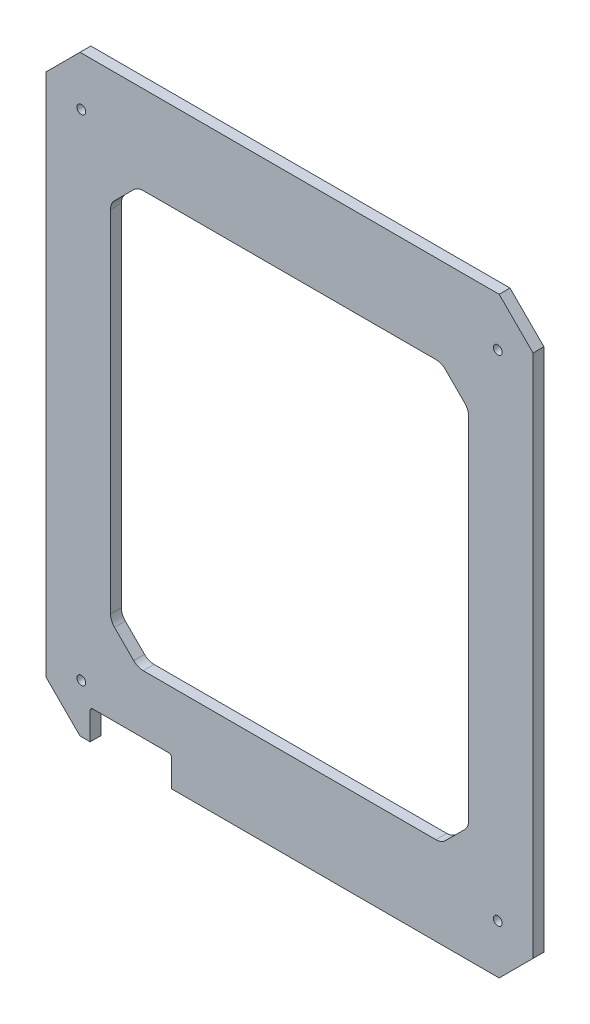
ISO-10303-21;
HEADER;
FILE_DESCRIPTION(('STEP AP214'),'2;1');
FILE_NAME('part.step','',(''),(''),'','','');
FILE_SCHEMA(('AUTOMOTIVE_DESIGN { 1 0 10303 214 1 1 1 1 }'));
ENDSEC;
DATA;
#1=APPLICATION_CONTEXT('core data for automotive mechanical design processes');
#2=APPLICATION_PROTOCOL_DEFINITION('international standard','automotive_design',2000,#1);
#3=PRODUCT_CONTEXT('',#1,'mechanical');
#4=PRODUCT('Part','Part','',(#3));
#5=PRODUCT_RELATED_PRODUCT_CATEGORY('part','',(#4));
#6=PRODUCT_DEFINITION_FORMATION('','',#4);
#7=PRODUCT_DEFINITION_CONTEXT('part definition',#1,'design');
#8=PRODUCT_DEFINITION('design','',#6,#7);
#9=PRODUCT_DEFINITION_SHAPE('','',#8);
#10=(LENGTH_UNIT() NAMED_UNIT(*) SI_UNIT(.MILLI.,.METRE.));
#11=(NAMED_UNIT(*) PLANE_ANGLE_UNIT() SI_UNIT($,.RADIAN.));
#12=(NAMED_UNIT(*) SI_UNIT($,.STERADIAN.) SOLID_ANGLE_UNIT());
#13=UNCERTAINTY_MEASURE_WITH_UNIT(LENGTH_MEASURE(1.E-05),#10,'distance_accuracy_value','');
#14=(GEOMETRIC_REPRESENTATION_CONTEXT(3) GLOBAL_UNCERTAINTY_ASSIGNED_CONTEXT((#13)) GLOBAL_UNIT_ASSIGNED_CONTEXT((#10,
#11,#12)) REPRESENTATION_CONTEXT('',''));
#15=CARTESIAN_POINT('',(0.,0.,0.));
#16=DIRECTION('',(0.,0.,1.));
#17=DIRECTION('',(1.,0.,0.));
#18=AXIS2_PLACEMENT_3D('',#15,#16,#17);
#19=CARTESIAN_POINT('',(-154.499999958625,-218.249999957125,0.));
#20=DIRECTION('',(0.,-1.,0.));
#21=DIRECTION('',(0.,0.,-1.));
#22=AXIS2_PLACEMENT_3D('',#19,#20,#21);
#23=PLANE('',#22);
#24=DIRECTION('',(0.,0.,1.));
#25=VECTOR('',#24,1.);
#26=CARTESIAN_POINT('',(-87.,-218.249999957125,-0.001000000000001));
#27=LINE('',#26,#25);
#28=CARTESIAN_POINT('',(-87.,-218.249999957125,0.));
#29=VERTEX_POINT('',#28);
#30=CARTESIAN_POINT('',(-87.,-218.249999957125,8.));
#31=VERTEX_POINT('',#30);
#32=EDGE_CURVE('E300',#29,#31,#27,.T.);
#33=ORIENTED_EDGE('',*,*,#32,.F.);
#34=DIRECTION('',(1.,0.,0.));
#35=VECTOR('',#34,1.);
#36=CARTESIAN_POINT('',(-154.499999958625,-218.249999957125,0.));
#37=LINE('',#36,#35);
#38=CARTESIAN_POINT('',(154.500000044375,-218.249999957125,0.));
#39=VERTEX_POINT('',#38);
#40=EDGE_CURVE('E456',#29,#39,#37,.T.);
#41=ORIENTED_EDGE('',*,*,#40,.T.);
#42=DIRECTION('',(0.,0.,1.));
#43=VECTOR('',#42,1.);
#44=CARTESIAN_POINT('',(154.500000044375,-218.249999957125,0.));
#45=LINE('',#44,#43);
#46=CARTESIAN_POINT('',(154.500000044375,-218.249999957125,8.));
#47=VERTEX_POINT('',#46);
#48=EDGE_CURVE('E509',#39,#47,#45,.T.);
#49=ORIENTED_EDGE('',*,*,#48,.T.);
#50=DIRECTION('',(1.,0.,0.));
#51=VECTOR('',#50,1.);
#52=CARTESIAN_POINT('',(-154.499999958625,-218.249999957125,8.));
#53=LINE('',#52,#51);
#54=EDGE_CURVE('E480',#31,#47,#53,.T.);
#55=ORIENTED_EDGE('',*,*,#54,.F.);
#56=EDGE_LOOP('',(#33,#41,#49,#55));
#57=FACE_BOUND('',#56,.T.);
#58=ADVANCED_FACE('F41',(#57),#23,.T.);
#59=CARTESIAN_POINT('',(0.,0.,0.));
#60=DIRECTION('',(0.,0.,1.));
#61=DIRECTION('',(1.,0.,0.));
#62=AXIS2_PLACEMENT_3D('',#59,#60,#61);
#63=PLANE('',#62);
#64=CARTESIAN_POINT('',(153.5,-182.25,0.));
#65=DIRECTION('',(0.,0.,-1.));
#66=DIRECTION('',(-1.,0.,0.));
#67=AXIS2_PLACEMENT_3D('',#64,#65,#66);
#68=CIRCLE('',#67,3.25);
#69=CARTESIAN_POINT('',(150.25,-182.25,0.));
#70=VERTEX_POINT('',#69);
#71=EDGE_CURVE('E260',#70,#70,#68,.T.);
#72=ORIENTED_EDGE('',*,*,#71,.F.);
#73=EDGE_LOOP('',(#72));
#74=FACE_BOUND('',#73,.T.);
#75=CARTESIAN_POINT('',(-153.5,-182.25,0.));
#76=DIRECTION('',(0.,0.,-1.));
#77=DIRECTION('',(-1.,0.,0.));
#78=AXIS2_PLACEMENT_3D('',#75,#76,#77);
#79=CIRCLE('',#78,3.25);
#80=CARTESIAN_POINT('',(-156.75,-182.25,0.));
#81=VERTEX_POINT('',#80);
#82=EDGE_CURVE('E308',#81,#81,#79,.T.);
#83=ORIENTED_EDGE('',*,*,#82,.F.);
#84=EDGE_LOOP('',(#83));
#85=FACE_BOUND('',#84,.T.);
#86=CARTESIAN_POINT('',(153.5,182.25,0.));
#87=DIRECTION('',(0.,0.,-1.));
#88=DIRECTION('',(-1.,0.,0.));
#89=AXIS2_PLACEMENT_3D('',#86,#87,#88);
#90=CIRCLE('',#89,3.25);
#91=CARTESIAN_POINT('',(150.25,182.25,0.));
#92=VERTEX_POINT('',#91);
#93=EDGE_CURVE('E314',#92,#92,#90,.T.);
#94=ORIENTED_EDGE('',*,*,#93,.F.);
#95=EDGE_LOOP('',(#94));
#96=FACE_BOUND('',#95,.T.);
#97=DIRECTION('',(-1.,0.,0.));
#98=VECTOR('',#97,1.);
#99=CARTESIAN_POINT('',(107.857864328668,-153.249999986912,0.));
#100=LINE('',#99,#98);
#101=CARTESIAN_POINT('',(107.857864328668,-153.249999986912,0.));
#102=VERTEX_POINT('',#101);
#103=CARTESIAN_POINT('',(-107.857864423332,-153.249999986913,0.));
#104=VERTEX_POINT('',#103);
#105=EDGE_CURVE('E377',#102,#104,#100,.T.);
#106=ORIENTED_EDGE('',*,*,#105,.F.);
#107=CARTESIAN_POINT('',(107.857864328668,-143.24999998392,0.));
#108=DIRECTION('',(0.,0.,-1.));
#109=DIRECTION('',(-1.,0.,0.));
#110=AXIS2_PLACEMENT_3D('',#107,#108,#109);
#111=CIRCLE('',#110,10.0000000029924);
#112=CARTESIAN_POINT('',(114.928932142649,-150.321067797901,0.));
#113=VERTEX_POINT('',#112);
#114=EDGE_CURVE('E66',#113,#102,#111,.T.);
#115=ORIENTED_EDGE('',*,*,#114,.F.);
#116=DIRECTION('',(-0.707106781186549,-0.707106781186546,0.));
#117=VECTOR('',#116,1.);
#118=CARTESIAN_POINT('',(129.07106776665,-136.178932173902,0.));
#119=LINE('',#118,#117);
#120=CARTESIAN_POINT('',(129.07106776665,-136.178932173902,0.));
#121=VERTEX_POINT('',#120);
#122=EDGE_CURVE('E330',#121,#113,#119,.T.);
#123=ORIENTED_EDGE('',*,*,#122,.F.);
#124=CARTESIAN_POINT('',(121.999999968748,-129.107864376,0.));
#125=DIRECTION('',(0.,0.,-1.));
#126=DIRECTION('',(-1.,0.,0.));
#127=AXIS2_PLACEMENT_3D('',#124,#125,#126);
#128=CIRCLE('',#127,9.99999998025203);
#129=CARTESIAN_POINT('',(131.999999949,-129.107864376,0.));
#130=VERTEX_POINT('',#129);
#131=EDGE_CURVE('E416',#130,#121,#128,.T.);
#132=ORIENTED_EDGE('',*,*,#131,.F.);
#133=DIRECTION('',(0.,-1.,0.));
#134=VECTOR('',#133,1.);
#135=CARTESIAN_POINT('',(131.999999949,129.107864376,0.));
#136=LINE('',#135,#134);
#137=CARTESIAN_POINT('',(131.999999949,129.107864376,0.));
#138=VERTEX_POINT('',#137);
#139=EDGE_CURVE('E413',#138,#130,#136,.T.);
#140=ORIENTED_EDGE('',*,*,#139,.F.);
#141=CARTESIAN_POINT('',(121.999999968796,129.107864376,0.));
#142=DIRECTION('',(0.,0.,-1.));
#143=DIRECTION('',(-1.,0.,0.));
#144=AXIS2_PLACEMENT_3D('',#141,#142,#143);
#145=CIRCLE('',#144,9.99999998020447);
#146=CARTESIAN_POINT('',(129.071067766664,136.178932173868,0.));
#147=VERTEX_POINT('',#146);
#148=EDGE_CURVE('E410',#147,#138,#145,.T.);
#149=ORIENTED_EDGE('',*,*,#148,.F.);
#150=DIRECTION('',(0.707106781186548,-0.707106781186547,0.));
#151=VECTOR('',#150,1.);
#152=CARTESIAN_POINT('',(114.928932142663,150.321067797868,0.));
#153=LINE('',#152,#151);
#154=CARTESIAN_POINT('',(114.928932142663,150.321067797868,0.));
#155=VERTEX_POINT('',#154);
#156=EDGE_CURVE('E407',#155,#147,#153,.T.);
#157=ORIENTED_EDGE('',*,*,#156,.F.);
#158=CARTESIAN_POINT('',(107.857864328648,143.249999983853,0.));
#159=DIRECTION('',(0.,0.,-1.));
#160=DIRECTION('',(-1.,0.,0.));
#161=AXIS2_PLACEMENT_3D('',#158,#159,#160);
#162=CIRCLE('',#161,10.0000000030401);
#163=CARTESIAN_POINT('',(107.857864328648,153.249999986893,0.));
#164=VERTEX_POINT('',#163);
#165=EDGE_CURVE('E404',#164,#155,#162,.T.);
#166=ORIENTED_EDGE('',*,*,#165,.F.);
#167=DIRECTION('',(1.,0.,0.));
#168=VECTOR('',#167,1.);
#169=CARTESIAN_POINT('',(-107.857864423352,153.249999986893,0.));
#170=LINE('',#169,#168);
#171=CARTESIAN_POINT('',(-107.857864423352,153.249999986893,0.));
#172=VERTEX_POINT('',#171);
#173=EDGE_CURVE('E401',#172,#164,#170,.T.);
#174=ORIENTED_EDGE('',*,*,#173,.F.);
#175=CARTESIAN_POINT('',(-107.857864423352,143.2499999839,0.));
#176=DIRECTION('',(0.,0.,-1.));
#177=DIRECTION('',(-1.,0.,0.));
#178=AXIS2_PLACEMENT_3D('',#175,#176,#177);
#179=CIRCLE('',#178,10.0000000029925);
#180=CARTESIAN_POINT('',(-114.928932237333,150.321067797882,0.));
#181=VERTEX_POINT('',#180);
#182=EDGE_CURVE('E398',#181,#172,#179,.T.);
#183=ORIENTED_EDGE('',*,*,#182,.F.);
#184=DIRECTION('',(0.707106781186546,0.707106781186549,0.));
#185=VECTOR('',#184,1.);
#186=CARTESIAN_POINT('',(-129.071067861333,136.178932173882,0.));
#187=LINE('',#186,#185);
#188=CARTESIAN_POINT('',(-129.071067861333,136.178932173882,0.));
#189=VERTEX_POINT('',#188);
#190=EDGE_CURVE('E395',#189,#181,#187,.T.);
#191=ORIENTED_EDGE('',*,*,#190,.F.);
#192=CARTESIAN_POINT('',(-122.000000063432,129.10786437598,0.));
#193=DIRECTION('',(0.,0.,-1.));
#194=DIRECTION('',(-1.,0.,0.));
#195=AXIS2_PLACEMENT_3D('',#192,#193,#194);
#196=CIRCLE('',#195,9.99999998025202);
#197=CARTESIAN_POINT('',(-132.000000043684,129.10786437598,0.));
#198=VERTEX_POINT('',#197);
#199=EDGE_CURVE('E392',#198,#189,#196,.T.);
#200=ORIENTED_EDGE('',*,*,#199,.F.);
#201=DIRECTION('',(0.,1.,0.));
#202=VECTOR('',#201,1.);
#203=CARTESIAN_POINT('',(-132.000000043684,-129.10786437602,0.));
#204=LINE('',#203,#202);
#205=CARTESIAN_POINT('',(-132.000000043684,-129.10786437602,0.));
#206=VERTEX_POINT('',#205);
#207=EDGE_CURVE('E389',#206,#198,#204,.T.);
#208=ORIENTED_EDGE('',*,*,#207,.F.);
#209=CARTESIAN_POINT('',(-122.000000063479,-129.10786437602,0.));
#210=DIRECTION('',(0.,0.,-1.));
#211=DIRECTION('',(-1.,0.,0.));
#212=AXIS2_PLACEMENT_3D('',#209,#210,#211);
#213=CIRCLE('',#212,9.99999998020442);
#214=CARTESIAN_POINT('',(-129.071067861347,-136.178932173888,0.));
#215=VERTEX_POINT('',#214);
#216=EDGE_CURVE('E386',#215,#206,#213,.T.);
#217=ORIENTED_EDGE('',*,*,#216,.F.);
#218=DIRECTION('',(-0.707106781186548,0.707106781186547,0.));
#219=VECTOR('',#218,1.);
#220=CARTESIAN_POINT('',(-114.928932237347,-150.321067797888,0.));
#221=LINE('',#220,#219);
#222=CARTESIAN_POINT('',(-114.928932237347,-150.321067797888,0.));
#223=VERTEX_POINT('',#222);
#224=EDGE_CURVE('E383',#223,#215,#221,.T.);
#225=ORIENTED_EDGE('',*,*,#224,.F.);
#226=CARTESIAN_POINT('',(-107.857864423332,-143.249999983872,0.));
#227=DIRECTION('',(0.,0.,-1.));
#228=DIRECTION('',(-1.,0.,0.));
#229=AXIS2_PLACEMENT_3D('',#226,#227,#228);
#230=CIRCLE('',#229,10.00000000304);
#231=EDGE_CURVE('E380',#104,#223,#230,.T.);
#232=ORIENTED_EDGE('',*,*,#231,.F.);
#233=EDGE_LOOP('',(#106,#115,#123,#132,#140,#149,#157,#166,#174,#183,#191,#200,#208,#217,#225,#232));
#234=FACE_BOUND('',#233,.T.);
#235=ORIENTED_EDGE('',*,*,#40,.F.);
#236=DIRECTION('',(0.,-1.,0.));
#237=VECTOR('',#236,1.);
#238=CARTESIAN_POINT('',(-87.,-218.249999957125,0.));
#239=LINE('',#238,#237);
#240=CARTESIAN_POINT('',(-87.,-198.249999957125,0.));
#241=VERTEX_POINT('',#240);
#242=EDGE_CURVE('E277',#241,#29,#239,.T.);
#243=ORIENTED_EDGE('',*,*,#242,.F.);
#244=CARTESIAN_POINT('',(-89.,-198.249999957125,0.));
#245=DIRECTION('',(0.,0.,1.));
#246=DIRECTION('',(1.,0.,0.));
#247=AXIS2_PLACEMENT_3D('',#244,#245,#246);
#248=CIRCLE('',#247,2.);
#249=CARTESIAN_POINT('',(-89.,-196.249999957125,0.));
#250=VERTEX_POINT('',#249);
#251=EDGE_CURVE('E271',#250,#241,#248,.F.);
#252=ORIENTED_EDGE('',*,*,#251,.F.);
#253=DIRECTION('',(1.,0.,0.));
#254=VECTOR('',#253,1.);
#255=CARTESIAN_POINT('',(-89.,-196.249999957125,0.));
#256=LINE('',#255,#254);
#257=CARTESIAN_POINT('',(-145.,-196.249999957125,0.));
#258=VERTEX_POINT('',#257);
#259=EDGE_CURVE('E268',#258,#250,#256,.T.);
#260=ORIENTED_EDGE('',*,*,#259,.F.);
#261=CARTESIAN_POINT('',(-145.,-198.249999957125,0.));
#262=DIRECTION('',(0.,0.,1.));
#263=DIRECTION('',(1.,0.,0.));
#264=AXIS2_PLACEMENT_3D('',#261,#262,#263);
#265=CIRCLE('',#264,1.99999999999999);
#266=CARTESIAN_POINT('',(-147.,-198.249999957125,0.));
#267=VERTEX_POINT('',#266);
#268=EDGE_CURVE('E247',#267,#258,#265,.F.);
#269=ORIENTED_EDGE('',*,*,#268,.F.);
#270=DIRECTION('',(0.,1.,0.));
#271=VECTOR('',#270,1.);
#272=CARTESIAN_POINT('',(-147.,-198.249999957125,0.));
#273=LINE('',#272,#271);
#274=CARTESIAN_POINT('',(-147.,-218.249999957125,0.));
#275=VERTEX_POINT('',#274);
#276=EDGE_CURVE('E255',#275,#267,#273,.T.);
#277=ORIENTED_EDGE('',*,*,#276,.F.);
#278=CARTESIAN_POINT('',(-154.499999958625,-218.249999957125,0.));
#279=VERTEX_POINT('',#278);
#280=EDGE_CURVE('E458',#279,#275,#37,.T.);
#281=ORIENTED_EDGE('',*,*,#280,.F.);
#282=DIRECTION('',(0.707106781186548,-0.707106781186548,0.));
#283=VECTOR('',#282,1.);
#284=CARTESIAN_POINT('',(-179.5,-193.24999991575,0.));
#285=LINE('',#284,#283);
#286=CARTESIAN_POINT('',(-179.5,-193.24999991575,0.));
#287=VERTEX_POINT('',#286);
#288=EDGE_CURVE('E453',#287,#279,#285,.T.);
#289=ORIENTED_EDGE('',*,*,#288,.F.);
#290=DIRECTION('',(0.,-1.,0.));
#291=VECTOR('',#290,1.);
#292=CARTESIAN_POINT('',(-179.5,193.24999991575,0.));
#293=LINE('',#292,#291);
#294=CARTESIAN_POINT('',(-179.5,193.24999991575,0.));
#295=VERTEX_POINT('',#294);
#296=EDGE_CURVE('E475',#295,#287,#293,.T.);
#297=ORIENTED_EDGE('',*,*,#296,.F.);
#298=DIRECTION('',(-0.707106781186547,-0.707106781186548,0.));
#299=VECTOR('',#298,1.);
#300=CARTESIAN_POINT('',(-154.499999958625,218.249999957125,0.));
#301=LINE('',#300,#299);
#302=CARTESIAN_POINT('',(-154.499999958625,218.249999957125,0.));
#303=VERTEX_POINT('',#302);
#304=EDGE_CURVE('E472',#303,#295,#301,.T.);
#305=ORIENTED_EDGE('',*,*,#304,.F.);
#306=DIRECTION('',(-1.,0.,0.));
#307=VECTOR('',#306,1.);
#308=CARTESIAN_POINT('',(154.500000044375,218.249999957125,0.));
#309=LINE('',#308,#307);
#310=CARTESIAN_POINT('',(154.500000044375,218.249999957125,0.));
#311=VERTEX_POINT('',#310);
#312=EDGE_CURVE('E469',#311,#303,#309,.T.);
#313=ORIENTED_EDGE('',*,*,#312,.F.);
#314=DIRECTION('',(-0.707106781186548,0.707106781186547,0.));
#315=VECTOR('',#314,1.);
#316=CARTESIAN_POINT('',(179.50000008575,193.24999991575,0.));
#317=LINE('',#316,#315);
#318=CARTESIAN_POINT('',(179.50000008575,193.24999991575,0.));
#319=VERTEX_POINT('',#318);
#320=EDGE_CURVE('E466',#319,#311,#317,.T.);
#321=ORIENTED_EDGE('',*,*,#320,.F.);
#322=DIRECTION('',(0.,1.,0.));
#323=VECTOR('',#322,1.);
#324=CARTESIAN_POINT('',(179.50000008575,-193.24999991575,0.));
#325=LINE('',#324,#323);
#326=CARTESIAN_POINT('',(179.50000008575,-193.24999991575,0.));
#327=VERTEX_POINT('',#326);
#328=EDGE_CURVE('E463',#327,#319,#325,.T.);
#329=ORIENTED_EDGE('',*,*,#328,.F.);
#330=DIRECTION('',(0.707106781186548,0.707106781186548,0.));
#331=VECTOR('',#330,1.);
#332=CARTESIAN_POINT('',(154.500000044375,-218.249999957125,0.));
#333=LINE('',#332,#331);
#334=EDGE_CURVE('E460',#39,#327,#333,.T.);
#335=ORIENTED_EDGE('',*,*,#334,.F.);
#336=EDGE_LOOP('',(#235,#243,#252,#260,#269,#277,#281,#289,#297,#305,#313,#321,#329,#335));
#337=FACE_BOUND('',#336,.T.);
#338=CARTESIAN_POINT('',(-153.5,182.25,0.));
#339=DIRECTION('',(0.,0.,-1.));
#340=DIRECTION('',(-1.,0.,0.));
#341=AXIS2_PLACEMENT_3D('',#338,#339,#340);
#342=CIRCLE('',#341,3.25);
#343=CARTESIAN_POINT('',(-156.75,182.25,0.));
#344=VERTEX_POINT('',#343);
#345=EDGE_CURVE('E320',#344,#344,#342,.T.);
#346=ORIENTED_EDGE('',*,*,#345,.F.);
#347=EDGE_LOOP('',(#346));
#348=FACE_BOUND('',#347,.T.);
#349=ADVANCED_FACE('F264',(#74,#85,#96,#234,#337,#348),#63,.F.);
#350=CARTESIAN_POINT('',(0.,0.,8.));
#351=DIRECTION('',(0.,0.,1.));
#352=DIRECTION('',(1.,0.,0.));
#353=AXIS2_PLACEMENT_3D('',#350,#351,#352);
#354=PLANE('',#353);
#355=DIRECTION('',(0.,1.,0.));
#356=VECTOR('',#355,1.);
#357=CARTESIAN_POINT('',(-87.,-218.249999957125,8.));
#358=LINE('',#357,#356);
#359=CARTESIAN_POINT('',(-87.,-198.249999957125,8.));
#360=VERTEX_POINT('',#359);
#361=EDGE_CURVE('E282',#31,#360,#358,.T.);
#362=ORIENTED_EDGE('',*,*,#361,.F.);
#363=ORIENTED_EDGE('',*,*,#54,.T.);
#364=DIRECTION('',(0.707106781186548,0.707106781186548,0.));
#365=VECTOR('',#364,1.);
#366=CARTESIAN_POINT('',(154.500000044375,-218.249999957125,8.));
#367=LINE('',#366,#365);
#368=CARTESIAN_POINT('',(179.50000008575,-193.24999991575,8.));
#369=VERTEX_POINT('',#368);
#370=EDGE_CURVE('E484',#47,#369,#367,.T.);
#371=ORIENTED_EDGE('',*,*,#370,.T.);
#372=DIRECTION('',(0.,1.,0.));
#373=VECTOR('',#372,1.);
#374=CARTESIAN_POINT('',(179.50000008575,-193.24999991575,8.));
#375=LINE('',#374,#373);
#376=CARTESIAN_POINT('',(179.50000008575,193.24999991575,8.));
#377=VERTEX_POINT('',#376);
#378=EDGE_CURVE('E487',#369,#377,#375,.T.);
#379=ORIENTED_EDGE('',*,*,#378,.T.);
#380=DIRECTION('',(-0.707106781186548,0.707106781186547,0.));
#381=VECTOR('',#380,1.);
#382=CARTESIAN_POINT('',(179.50000008575,193.24999991575,8.));
#383=LINE('',#382,#381);
#384=CARTESIAN_POINT('',(154.500000044375,218.249999957125,8.));
#385=VERTEX_POINT('',#384);
#386=EDGE_CURVE('E490',#377,#385,#383,.T.);
#387=ORIENTED_EDGE('',*,*,#386,.T.);
#388=DIRECTION('',(-1.,0.,0.));
#389=VECTOR('',#388,1.);
#390=CARTESIAN_POINT('',(154.500000044375,218.249999957125,8.));
#391=LINE('',#390,#389);
#392=CARTESIAN_POINT('',(-154.499999958625,218.249999957125,8.));
#393=VERTEX_POINT('',#392);
#394=EDGE_CURVE('E493',#385,#393,#391,.T.);
#395=ORIENTED_EDGE('',*,*,#394,.T.);
#396=DIRECTION('',(-0.707106781186547,-0.707106781186548,0.));
#397=VECTOR('',#396,1.);
#398=CARTESIAN_POINT('',(-154.499999958625,218.249999957125,8.));
#399=LINE('',#398,#397);
#400=CARTESIAN_POINT('',(-179.5,193.24999991575,8.));
#401=VERTEX_POINT('',#400);
#402=EDGE_CURVE('E496',#393,#401,#399,.T.);
#403=ORIENTED_EDGE('',*,*,#402,.T.);
#404=DIRECTION('',(0.,-1.,0.));
#405=VECTOR('',#404,1.);
#406=CARTESIAN_POINT('',(-179.5,193.24999991575,8.));
#407=LINE('',#406,#405);
#408=CARTESIAN_POINT('',(-179.5,-193.24999991575,8.));
#409=VERTEX_POINT('',#408);
#410=EDGE_CURVE('E457',#401,#409,#407,.T.);
#411=ORIENTED_EDGE('',*,*,#410,.T.);
#412=DIRECTION('',(0.707106781186548,-0.707106781186548,0.));
#413=VECTOR('',#412,1.);
#414=CARTESIAN_POINT('',(-179.5,-193.24999991575,8.));
#415=LINE('',#414,#413);
#416=CARTESIAN_POINT('',(-154.499999958625,-218.249999957125,8.));
#417=VERTEX_POINT('',#416);
#418=EDGE_CURVE('E423',#409,#417,#415,.T.);
#419=ORIENTED_EDGE('',*,*,#418,.T.);
#420=CARTESIAN_POINT('',(-147.,-218.249999957125,8.));
#421=VERTEX_POINT('',#420);
#422=EDGE_CURVE('E481',#417,#421,#53,.T.);
#423=ORIENTED_EDGE('',*,*,#422,.T.);
#424=DIRECTION('',(0.,-1.,0.));
#425=VECTOR('',#424,1.);
#426=CARTESIAN_POINT('',(-147.,-198.249999957125,8.));
#427=LINE('',#426,#425);
#428=CARTESIAN_POINT('',(-147.,-198.249999957125,8.));
#429=VERTEX_POINT('',#428);
#430=EDGE_CURVE('E58',#429,#421,#427,.T.);
#431=ORIENTED_EDGE('',*,*,#430,.F.);
#432=CARTESIAN_POINT('',(-145.,-198.249999957125,8.));
#433=DIRECTION('',(0.,0.,1.));
#434=DIRECTION('',(1.,0.,0.));
#435=AXIS2_PLACEMENT_3D('',#432,#433,#434);
#436=CIRCLE('',#435,1.99999999999999);
#437=CARTESIAN_POINT('',(-145.,-196.249999957125,8.));
#438=VERTEX_POINT('',#437);
#439=EDGE_CURVE('E250',#438,#429,#436,.T.);
#440=ORIENTED_EDGE('',*,*,#439,.F.);
#441=DIRECTION('',(-1.,0.,0.));
#442=VECTOR('',#441,1.);
#443=CARTESIAN_POINT('',(-89.,-196.249999957125,8.));
#444=LINE('',#443,#442);
#445=CARTESIAN_POINT('',(-89.,-196.249999957125,8.));
#446=VERTEX_POINT('',#445);
#447=EDGE_CURVE('E252',#446,#438,#444,.T.);
#448=ORIENTED_EDGE('',*,*,#447,.F.);
#449=CARTESIAN_POINT('',(-89.,-198.249999957125,8.));
#450=DIRECTION('',(0.,0.,1.));
#451=DIRECTION('',(1.,0.,0.));
#452=AXIS2_PLACEMENT_3D('',#449,#450,#451);
#453=CIRCLE('',#452,2.);
#454=EDGE_CURVE('E286',#360,#446,#453,.T.);
#455=ORIENTED_EDGE('',*,*,#454,.F.);
#456=EDGE_LOOP('',(#362,#363,#371,#379,#387,#395,#403,#411,#419,#423,#431,#440,#448,#455));
#457=FACE_BOUND('',#456,.T.);
#458=CARTESIAN_POINT('',(153.5,-182.25,8.00000000000001));
#459=DIRECTION('',(0.,0.,-1.));
#460=DIRECTION('',(-1.,0.,0.));
#461=AXIS2_PLACEMENT_3D('',#458,#459,#460);
#462=CIRCLE('',#461,3.25);
#463=CARTESIAN_POINT('',(150.25,-182.25,8.00000000000001));
#464=VERTEX_POINT('',#463);
#465=EDGE_CURVE('E305',#464,#464,#462,.T.);
#466=ORIENTED_EDGE('',*,*,#465,.T.);
#467=EDGE_LOOP('',(#466));
#468=FACE_BOUND('',#467,.T.);
#469=CARTESIAN_POINT('',(-153.5,-182.25,8.00000000000001));
#470=DIRECTION('',(0.,0.,-1.));
#471=DIRECTION('',(-1.,0.,0.));
#472=AXIS2_PLACEMENT_3D('',#469,#470,#471);
#473=CIRCLE('',#472,3.25);
#474=CARTESIAN_POINT('',(-156.75,-182.25,8.00000000000001));
#475=VERTEX_POINT('',#474);
#476=EDGE_CURVE('E311',#475,#475,#473,.T.);
#477=ORIENTED_EDGE('',*,*,#476,.T.);
#478=EDGE_LOOP('',(#477));
#479=FACE_BOUND('',#478,.T.);
#480=CARTESIAN_POINT('',(153.5,182.25,8.00000000000001));
#481=DIRECTION('',(0.,0.,-1.));
#482=DIRECTION('',(-1.,0.,0.));
#483=AXIS2_PLACEMENT_3D('',#480,#481,#482);
#484=CIRCLE('',#483,3.25);
#485=CARTESIAN_POINT('',(150.25,182.25,8.00000000000001));
#486=VERTEX_POINT('',#485);
#487=EDGE_CURVE('E317',#486,#486,#484,.T.);
#488=ORIENTED_EDGE('',*,*,#487,.T.);
#489=EDGE_LOOP('',(#488));
#490=FACE_BOUND('',#489,.T.);
#491=CARTESIAN_POINT('',(107.857864328668,-143.24999998392,8.));
#492=DIRECTION('',(0.,0.,-1.));
#493=DIRECTION('',(-1.,0.,0.));
#494=AXIS2_PLACEMENT_3D('',#491,#492,#493);
#495=CIRCLE('',#494,10.0000000029924);
#496=CARTESIAN_POINT('',(114.928932142649,-150.321067797901,8.));
#497=VERTEX_POINT('',#496);
#498=CARTESIAN_POINT('',(107.857864328668,-153.249999986912,8.));
#499=VERTEX_POINT('',#498);
#500=EDGE_CURVE('E326',#497,#499,#495,.T.);
#501=ORIENTED_EDGE('',*,*,#500,.T.);
#502=DIRECTION('',(-1.,0.,0.));
#503=VECTOR('',#502,1.);
#504=CARTESIAN_POINT('',(107.857864328668,-153.249999986912,8.));
#505=LINE('',#504,#503);
#506=CARTESIAN_POINT('',(-107.857864423332,-153.249999986913,8.));
#507=VERTEX_POINT('',#506);
#508=EDGE_CURVE('E329',#499,#507,#505,.T.);
#509=ORIENTED_EDGE('',*,*,#508,.T.);
#510=CARTESIAN_POINT('',(-107.857864423332,-143.249999983872,8.));
#511=DIRECTION('',(0.,0.,-1.));
#512=DIRECTION('',(-1.,0.,0.));
#513=AXIS2_PLACEMENT_3D('',#510,#511,#512);
#514=CIRCLE('',#513,10.00000000304);
#515=CARTESIAN_POINT('',(-114.928932237347,-150.321067797888,8.));
#516=VERTEX_POINT('',#515);
#517=EDGE_CURVE('E333',#507,#516,#514,.T.);
#518=ORIENTED_EDGE('',*,*,#517,.T.);
#519=DIRECTION('',(-0.707106781186548,0.707106781186547,0.));
#520=VECTOR('',#519,1.);
#521=CARTESIAN_POINT('',(-114.928932237347,-150.321067797888,8.));
#522=LINE('',#521,#520);
#523=CARTESIAN_POINT('',(-129.071067861347,-136.178932173888,8.));
#524=VERTEX_POINT('',#523);
#525=EDGE_CURVE('E336',#516,#524,#522,.T.);
#526=ORIENTED_EDGE('',*,*,#525,.T.);
#527=CARTESIAN_POINT('',(-122.000000063479,-129.10786437602,8.));
#528=DIRECTION('',(0.,0.,-1.));
#529=DIRECTION('',(-1.,0.,0.));
#530=AXIS2_PLACEMENT_3D('',#527,#528,#529);
#531=CIRCLE('',#530,9.99999998020442);
#532=CARTESIAN_POINT('',(-132.000000043684,-129.10786437602,8.));
#533=VERTEX_POINT('',#532);
#534=EDGE_CURVE('E339',#524,#533,#531,.T.);
#535=ORIENTED_EDGE('',*,*,#534,.T.);
#536=DIRECTION('',(0.,1.,0.));
#537=VECTOR('',#536,1.);
#538=CARTESIAN_POINT('',(-132.000000043684,-129.10786437602,8.));
#539=LINE('',#538,#537);
#540=CARTESIAN_POINT('',(-132.000000043684,129.10786437598,8.));
#541=VERTEX_POINT('',#540);
#542=EDGE_CURVE('E342',#533,#541,#539,.T.);
#543=ORIENTED_EDGE('',*,*,#542,.T.);
#544=CARTESIAN_POINT('',(-122.000000063432,129.10786437598,8.));
#545=DIRECTION('',(0.,0.,-1.));
#546=DIRECTION('',(-1.,0.,0.));
#547=AXIS2_PLACEMENT_3D('',#544,#545,#546);
#548=CIRCLE('',#547,9.99999998025202);
#549=CARTESIAN_POINT('',(-129.071067861333,136.178932173882,8.));
#550=VERTEX_POINT('',#549);
#551=EDGE_CURVE('E345',#541,#550,#548,.T.);
#552=ORIENTED_EDGE('',*,*,#551,.T.);
#553=DIRECTION('',(0.707106781186546,0.707106781186549,0.));
#554=VECTOR('',#553,1.);
#555=CARTESIAN_POINT('',(-129.071067861333,136.178932173882,8.));
#556=LINE('',#555,#554);
#557=CARTESIAN_POINT('',(-114.928932237333,150.321067797882,8.));
#558=VERTEX_POINT('',#557);
#559=EDGE_CURVE('E348',#550,#558,#556,.T.);
#560=ORIENTED_EDGE('',*,*,#559,.T.);
#561=CARTESIAN_POINT('',(-107.857864423352,143.2499999839,8.));
#562=DIRECTION('',(0.,0.,-1.));
#563=DIRECTION('',(-1.,0.,0.));
#564=AXIS2_PLACEMENT_3D('',#561,#562,#563);
#565=CIRCLE('',#564,10.0000000029925);
#566=CARTESIAN_POINT('',(-107.857864423352,153.249999986893,8.));
#567=VERTEX_POINT('',#566);
#568=EDGE_CURVE('E351',#558,#567,#565,.T.);
#569=ORIENTED_EDGE('',*,*,#568,.T.);
#570=DIRECTION('',(1.,0.,0.));
#571=VECTOR('',#570,1.);
#572=CARTESIAN_POINT('',(-107.857864423352,153.249999986893,8.));
#573=LINE('',#572,#571);
#574=CARTESIAN_POINT('',(107.857864328648,153.249999986893,8.));
#575=VERTEX_POINT('',#574);
#576=EDGE_CURVE('E354',#567,#575,#573,.T.);
#577=ORIENTED_EDGE('',*,*,#576,.T.);
#578=CARTESIAN_POINT('',(107.857864328648,143.249999983853,8.));
#579=DIRECTION('',(0.,0.,-1.));
#580=DIRECTION('',(-1.,0.,0.));
#581=AXIS2_PLACEMENT_3D('',#578,#579,#580);
#582=CIRCLE('',#581,10.0000000030401);
#583=CARTESIAN_POINT('',(114.928932142663,150.321067797868,8.));
#584=VERTEX_POINT('',#583);
#585=EDGE_CURVE('E357',#575,#584,#582,.T.);
#586=ORIENTED_EDGE('',*,*,#585,.T.);
#587=DIRECTION('',(0.707106781186548,-0.707106781186547,0.));
#588=VECTOR('',#587,1.);
#589=CARTESIAN_POINT('',(114.928932142663,150.321067797868,8.));
#590=LINE('',#589,#588);
#591=CARTESIAN_POINT('',(129.071067766664,136.178932173868,8.));
#592=VERTEX_POINT('',#591);
#593=EDGE_CURVE('E360',#584,#592,#590,.T.);
#594=ORIENTED_EDGE('',*,*,#593,.T.);
#595=CARTESIAN_POINT('',(121.999999968796,129.107864376,8.));
#596=DIRECTION('',(0.,0.,-1.));
#597=DIRECTION('',(-1.,0.,0.));
#598=AXIS2_PLACEMENT_3D('',#595,#596,#597);
#599=CIRCLE('',#598,9.99999998020447);
#600=CARTESIAN_POINT('',(131.999999949,129.107864376,8.));
#601=VERTEX_POINT('',#600);
#602=EDGE_CURVE('E363',#592,#601,#599,.T.);
#603=ORIENTED_EDGE('',*,*,#602,.T.);
#604=DIRECTION('',(0.,-1.,0.));
#605=VECTOR('',#604,1.);
#606=CARTESIAN_POINT('',(131.999999949,129.107864376,8.));
#607=LINE('',#606,#605);
#608=CARTESIAN_POINT('',(131.999999949,-129.107864376,8.));
#609=VERTEX_POINT('',#608);
#610=EDGE_CURVE('E366',#601,#609,#607,.T.);
#611=ORIENTED_EDGE('',*,*,#610,.T.);
#612=CARTESIAN_POINT('',(121.999999968748,-129.107864376,8.));
#613=DIRECTION('',(0.,0.,-1.));
#614=DIRECTION('',(-1.,0.,0.));
#615=AXIS2_PLACEMENT_3D('',#612,#613,#614);
#616=CIRCLE('',#615,9.99999998025203);
#617=CARTESIAN_POINT('',(129.07106776665,-136.178932173902,8.));
#618=VERTEX_POINT('',#617);
#619=EDGE_CURVE('E369',#609,#618,#616,.T.);
#620=ORIENTED_EDGE('',*,*,#619,.T.);
#621=DIRECTION('',(-0.707106781186549,-0.707106781186546,0.));
#622=VECTOR('',#621,1.);
#623=CARTESIAN_POINT('',(129.07106776665,-136.178932173902,8.));
#624=LINE('',#623,#622);
#625=EDGE_CURVE('E372',#618,#497,#624,.T.);
#626=ORIENTED_EDGE('',*,*,#625,.T.);
#627=EDGE_LOOP('',(#501,#509,#518,#526,#535,#543,#552,#560,#569,#577,#586,#594,#603,#611,#620,#626));
#628=FACE_BOUND('',#627,.T.);
#629=CARTESIAN_POINT('',(-153.5,182.25,8.00000000000001));
#630=DIRECTION('',(0.,0.,-1.));
#631=DIRECTION('',(-1.,0.,0.));
#632=AXIS2_PLACEMENT_3D('',#629,#630,#631);
#633=CIRCLE('',#632,3.25);
#634=CARTESIAN_POINT('',(-156.75,182.25,8.00000000000001));
#635=VERTEX_POINT('',#634);
#636=EDGE_CURVE('E323',#635,#635,#633,.T.);
#637=ORIENTED_EDGE('',*,*,#636,.T.);
#638=EDGE_LOOP('',(#637));
#639=FACE_BOUND('',#638,.T.);
#640=ADVANCED_FACE('F523',(#457,#468,#479,#490,#628,#639),#354,.T.);
#641=CARTESIAN_POINT('',(-179.5,-193.24999991575,0.));
#642=DIRECTION('',(-0.707106781186548,-0.707106781186548,0.));
#643=DIRECTION('',(0.707106781186548,-0.707106781186548,0.));
#644=AXIS2_PLACEMENT_3D('',#641,#642,#643);
#645=PLANE('',#644);
#646=ORIENTED_EDGE('',*,*,#418,.F.);
#647=DIRECTION('',(0.,0.,1.));
#648=VECTOR('',#647,1.);
#649=CARTESIAN_POINT('',(-179.5,-193.24999991575,0.));
#650=LINE('',#649,#648);
#651=EDGE_CURVE('E11',#287,#409,#650,.T.);
#652=ORIENTED_EDGE('',*,*,#651,.F.);
#653=ORIENTED_EDGE('',*,*,#288,.T.);
#654=DIRECTION('',(0.,0.,1.));
#655=VECTOR('',#654,1.);
#656=CARTESIAN_POINT('',(-154.499999958625,-218.249999957125,0.));
#657=LINE('',#656,#655);
#658=EDGE_CURVE('E45',#279,#417,#657,.T.);
#659=ORIENTED_EDGE('',*,*,#658,.T.);
#660=EDGE_LOOP('',(#646,#652,#653,#659));
#661=FACE_BOUND('',#660,.T.);
#662=ADVANCED_FACE('F43',(#661),#645,.T.);
#663=CARTESIAN_POINT('',(-179.5,193.24999991575,0.));
#664=DIRECTION('',(-1.,0.,0.));
#665=DIRECTION('',(0.,-1.,0.));
#666=AXIS2_PLACEMENT_3D('',#663,#664,#665);
#667=PLANE('',#666);
#668=ORIENTED_EDGE('',*,*,#410,.F.);
#669=DIRECTION('',(0.,0.,1.));
#670=VECTOR('',#669,1.);
#671=CARTESIAN_POINT('',(-179.5,193.24999991575,0.));
#672=LINE('',#671,#670);
#673=EDGE_CURVE('E50',#295,#401,#672,.T.);
#674=ORIENTED_EDGE('',*,*,#673,.F.);
#675=ORIENTED_EDGE('',*,*,#296,.T.);
#676=ORIENTED_EDGE('',*,*,#651,.T.);
#677=EDGE_LOOP('',(#668,#674,#675,#676));
#678=FACE_BOUND('',#677,.T.);
#679=ADVANCED_FACE('F528',(#678),#667,.T.);
#680=CARTESIAN_POINT('',(-154.499999958625,218.249999957125,0.));
#681=DIRECTION('',(-0.707106781186548,0.707106781186547,0.));
#682=DIRECTION('',(-0.707106781186547,-0.707106781186548,0.));
#683=AXIS2_PLACEMENT_3D('',#680,#681,#682);
#684=PLANE('',#683);
#685=ORIENTED_EDGE('',*,*,#402,.F.);
#686=DIRECTION('',(0.,0.,1.));
#687=VECTOR('',#686,1.);
#688=CARTESIAN_POINT('',(-154.499999958625,218.249999957125,0.));
#689=LINE('',#688,#687);
#690=EDGE_CURVE('E502',#303,#393,#689,.T.);
#691=ORIENTED_EDGE('',*,*,#690,.F.);
#692=ORIENTED_EDGE('',*,*,#304,.T.);
#693=ORIENTED_EDGE('',*,*,#673,.T.);
#694=EDGE_LOOP('',(#685,#691,#692,#693));
#695=FACE_BOUND('',#694,.T.);
#696=ADVANCED_FACE('F593',(#695),#684,.T.);
#697=CARTESIAN_POINT('',(154.500000044375,218.249999957125,0.));
#698=DIRECTION('',(0.,1.,0.));
#699=DIRECTION('',(-1.,0.,0.));
#700=AXIS2_PLACEMENT_3D('',#697,#698,#699);
#701=PLANE('',#700);
#702=ORIENTED_EDGE('',*,*,#394,.F.);
#703=DIRECTION('',(0.,0.,1.));
#704=VECTOR('',#703,1.);
#705=CARTESIAN_POINT('',(154.500000044375,218.249999957125,0.));
#706=LINE('',#705,#704);
#707=EDGE_CURVE('E504',#311,#385,#706,.T.);
#708=ORIENTED_EDGE('',*,*,#707,.F.);
#709=ORIENTED_EDGE('',*,*,#312,.T.);
#710=ORIENTED_EDGE('',*,*,#690,.T.);
#711=EDGE_LOOP('',(#702,#708,#709,#710));
#712=FACE_BOUND('',#711,.T.);
#713=ADVANCED_FACE('F536',(#712),#701,.T.);
#714=CARTESIAN_POINT('',(179.50000008575,193.24999991575,0.));
#715=DIRECTION('',(0.707106781186547,0.707106781186548,0.));
#716=DIRECTION('',(-0.707106781186548,0.707106781186547,0.));
#717=AXIS2_PLACEMENT_3D('',#714,#715,#716);
#718=PLANE('',#717);
#719=ORIENTED_EDGE('',*,*,#386,.F.);
#720=DIRECTION('',(0.,0.,1.));
#721=VECTOR('',#720,1.);
#722=CARTESIAN_POINT('',(179.50000008575,193.24999991575,0.));
#723=LINE('',#722,#721);
#724=EDGE_CURVE('E506',#319,#377,#723,.T.);
#725=ORIENTED_EDGE('',*,*,#724,.F.);
#726=ORIENTED_EDGE('',*,*,#320,.T.);
#727=ORIENTED_EDGE('',*,*,#707,.T.);
#728=EDGE_LOOP('',(#719,#725,#726,#727));
#729=FACE_BOUND('',#728,.T.);
#730=ADVANCED_FACE('F539',(#729),#718,.T.);
#731=CARTESIAN_POINT('',(179.50000008575,-193.24999991575,0.));
#732=DIRECTION('',(1.,0.,0.));
#733=DIRECTION('',(0.,0.,-1.));
#734=AXIS2_PLACEMENT_3D('',#731,#732,#733);
#735=PLANE('',#734);
#736=ORIENTED_EDGE('',*,*,#378,.F.);
#737=DIRECTION('',(0.,0.,1.));
#738=VECTOR('',#737,1.);
#739=CARTESIAN_POINT('',(179.50000008575,-193.24999991575,0.));
#740=LINE('',#739,#738);
#741=EDGE_CURVE('E508',#327,#369,#740,.T.);
#742=ORIENTED_EDGE('',*,*,#741,.F.);
#743=ORIENTED_EDGE('',*,*,#328,.T.);
#744=ORIENTED_EDGE('',*,*,#724,.T.);
#745=EDGE_LOOP('',(#736,#742,#743,#744));
#746=FACE_BOUND('',#745,.T.);
#747=ADVANCED_FACE('F544',(#746),#735,.T.);
#748=CARTESIAN_POINT('',(154.500000044375,-218.249999957125,0.));
#749=DIRECTION('',(0.707106781186548,-0.707106781186548,0.));
#750=DIRECTION('',(0.707106781186548,0.707106781186548,0.));
#751=AXIS2_PLACEMENT_3D('',#748,#749,#750);
#752=PLANE('',#751);
#753=ORIENTED_EDGE('',*,*,#370,.F.);
#754=ORIENTED_EDGE('',*,*,#48,.F.);
#755=ORIENTED_EDGE('',*,*,#334,.T.);
#756=ORIENTED_EDGE('',*,*,#741,.T.);
#757=EDGE_LOOP('',(#753,#754,#755,#756));
#758=FACE_BOUND('',#757,.T.);
#759=ADVANCED_FACE('F546',(#758),#752,.T.);
#760=DIRECTION('',(0.,0.,1.));
#761=VECTOR('',#760,1.);
#762=CARTESIAN_POINT('',(-147.,-218.249999957125,-0.001000000000001));
#763=LINE('',#762,#761);
#764=EDGE_CURVE('E251',#275,#421,#763,.T.);
#765=ORIENTED_EDGE('',*,*,#764,.T.);
#766=ORIENTED_EDGE('',*,*,#422,.F.);
#767=ORIENTED_EDGE('',*,*,#658,.F.);
#768=ORIENTED_EDGE('',*,*,#280,.T.);
#769=EDGE_LOOP('',(#765,#766,#767,#768));
#770=FACE_BOUND('',#769,.T.);
#771=ADVANCED_FACE('F520',(#770),#23,.T.);
#772=CARTESIAN_POINT('',(107.857864328668,-143.24999998392,8.));
#773=DIRECTION('',(0.,0.,-1.));
#774=DIRECTION('',(-1.,0.,0.));
#775=AXIS2_PLACEMENT_3D('',#772,#773,#774);
#776=CYLINDRICAL_SURFACE('',#775,10.0000000029924);
#777=ORIENTED_EDGE('',*,*,#114,.T.);
#778=DIRECTION('',(0.,0.,-1.));
#779=VECTOR('',#778,1.);
#780=CARTESIAN_POINT('',(107.857864328668,-153.249999986912,8.));
#781=LINE('',#780,#779);
#782=EDGE_CURVE('E375',#499,#102,#781,.T.);
#783=ORIENTED_EDGE('',*,*,#782,.F.);
#784=ORIENTED_EDGE('',*,*,#500,.F.);
#785=DIRECTION('',(0.,0.,-1.));
#786=VECTOR('',#785,1.);
#787=CARTESIAN_POINT('',(114.928932142649,-150.321067797901,8.));
#788=LINE('',#787,#786);
#789=EDGE_CURVE('E421',#497,#113,#788,.T.);
#790=ORIENTED_EDGE('',*,*,#789,.T.);
#791=EDGE_LOOP('',(#777,#783,#784,#790));
#792=FACE_BOUND('',#791,.T.);
#793=ADVANCED_FACE('F575',(#792),#776,.F.);
#794=CARTESIAN_POINT('',(129.07106776665,-136.178932173902,8.));
#795=DIRECTION('',(0.707106781186546,-0.707106781186549,0.));
#796=DIRECTION('',(0.707106781186549,0.707106781186546,0.));
#797=AXIS2_PLACEMENT_3D('',#794,#795,#796);
#798=PLANE('',#797);
#799=ORIENTED_EDGE('',*,*,#122,.T.);
#800=ORIENTED_EDGE('',*,*,#789,.F.);
#801=ORIENTED_EDGE('',*,*,#625,.F.);
#802=DIRECTION('',(0.,0.,-1.));
#803=VECTOR('',#802,1.);
#804=CARTESIAN_POINT('',(129.07106776665,-136.178932173902,8.));
#805=LINE('',#804,#803);
#806=EDGE_CURVE('E424',#618,#121,#805,.T.);
#807=ORIENTED_EDGE('',*,*,#806,.T.);
#808=EDGE_LOOP('',(#799,#800,#801,#807));
#809=FACE_BOUND('',#808,.T.);
#810=ADVANCED_FACE('F581',(#809),#798,.F.);
#811=CARTESIAN_POINT('',(121.999999968748,-129.107864376,8.));
#812=DIRECTION('',(0.,0.,-1.));
#813=DIRECTION('',(-1.,0.,0.));
#814=AXIS2_PLACEMENT_3D('',#811,#812,#813);
#815=CYLINDRICAL_SURFACE('',#814,9.99999998025203);
#816=ORIENTED_EDGE('',*,*,#131,.T.);
#817=ORIENTED_EDGE('',*,*,#806,.F.);
#818=ORIENTED_EDGE('',*,*,#619,.F.);
#819=DIRECTION('',(0.,0.,-1.));
#820=VECTOR('',#819,1.);
#821=CARTESIAN_POINT('',(131.999999949,-129.107864376,8.));
#822=LINE('',#821,#820);
#823=EDGE_CURVE('E426',#609,#130,#822,.T.);
#824=ORIENTED_EDGE('',*,*,#823,.T.);
#825=EDGE_LOOP('',(#816,#817,#818,#824));
#826=FACE_BOUND('',#825,.T.);
#827=ADVANCED_FACE('F652',(#826),#815,.F.);
#828=CARTESIAN_POINT('',(131.999999949,129.107864376,8.));
#829=DIRECTION('',(1.,0.,0.));
#830=DIRECTION('',(0.,0.,-1.));
#831=AXIS2_PLACEMENT_3D('',#828,#829,#830);
#832=PLANE('',#831);
#833=ORIENTED_EDGE('',*,*,#139,.T.);
#834=ORIENTED_EDGE('',*,*,#823,.F.);
#835=ORIENTED_EDGE('',*,*,#610,.F.);
#836=DIRECTION('',(0.,0.,-1.));
#837=VECTOR('',#836,1.);
#838=CARTESIAN_POINT('',(131.999999949,129.107864376,8.));
#839=LINE('',#838,#837);
#840=EDGE_CURVE('E428',#601,#138,#839,.T.);
#841=ORIENTED_EDGE('',*,*,#840,.T.);
#842=EDGE_LOOP('',(#833,#834,#835,#841));
#843=FACE_BOUND('',#842,.T.);
#844=ADVANCED_FACE('F648',(#843),#832,.F.);
#845=CARTESIAN_POINT('',(121.999999968796,129.107864376,8.));
#846=DIRECTION('',(0.,0.,-1.));
#847=DIRECTION('',(-1.,0.,0.));
#848=AXIS2_PLACEMENT_3D('',#845,#846,#847);
#849=CYLINDRICAL_SURFACE('',#848,9.99999998020447);
#850=ORIENTED_EDGE('',*,*,#148,.T.);
#851=ORIENTED_EDGE('',*,*,#840,.F.);
#852=ORIENTED_EDGE('',*,*,#602,.F.);
#853=DIRECTION('',(0.,0.,-1.));
#854=VECTOR('',#853,1.);
#855=CARTESIAN_POINT('',(129.071067766664,136.178932173868,8.));
#856=LINE('',#855,#854);
#857=EDGE_CURVE('E430',#592,#147,#856,.T.);
#858=ORIENTED_EDGE('',*,*,#857,.T.);
#859=EDGE_LOOP('',(#850,#851,#852,#858));
#860=FACE_BOUND('',#859,.T.);
#861=ADVANCED_FACE('F644',(#860),#849,.F.);
#862=CARTESIAN_POINT('',(114.928932142663,150.321067797868,8.));
#863=DIRECTION('',(0.707106781186547,0.707106781186548,0.));
#864=DIRECTION('',(-0.707106781186548,0.707106781186547,0.));
#865=AXIS2_PLACEMENT_3D('',#862,#863,#864);
#866=PLANE('',#865);
#867=ORIENTED_EDGE('',*,*,#156,.T.);
#868=ORIENTED_EDGE('',*,*,#857,.F.);
#869=ORIENTED_EDGE('',*,*,#593,.F.);
#870=DIRECTION('',(0.,0.,-1.));
#871=VECTOR('',#870,1.);
#872=CARTESIAN_POINT('',(114.928932142663,150.321067797868,8.));
#873=LINE('',#872,#871);
#874=EDGE_CURVE('E432',#584,#155,#873,.T.);
#875=ORIENTED_EDGE('',*,*,#874,.T.);
#876=EDGE_LOOP('',(#867,#868,#869,#875));
#877=FACE_BOUND('',#876,.T.);
#878=ADVANCED_FACE('F640',(#877),#866,.F.);
#879=CARTESIAN_POINT('',(107.857864328648,143.249999983853,8.));
#880=DIRECTION('',(0.,0.,-1.));
#881=DIRECTION('',(-1.,0.,0.));
#882=AXIS2_PLACEMENT_3D('',#879,#880,#881);
#883=CYLINDRICAL_SURFACE('',#882,10.0000000030401);
#884=ORIENTED_EDGE('',*,*,#165,.T.);
#885=ORIENTED_EDGE('',*,*,#874,.F.);
#886=ORIENTED_EDGE('',*,*,#585,.F.);
#887=DIRECTION('',(0.,0.,-1.));
#888=VECTOR('',#887,1.);
#889=CARTESIAN_POINT('',(107.857864328648,153.249999986893,8.));
#890=LINE('',#889,#888);
#891=EDGE_CURVE('E434',#575,#164,#890,.T.);
#892=ORIENTED_EDGE('',*,*,#891,.T.);
#893=EDGE_LOOP('',(#884,#885,#886,#892));
#894=FACE_BOUND('',#893,.T.);
#895=ADVANCED_FACE('F636',(#894),#883,.F.);
#896=CARTESIAN_POINT('',(-107.857864423352,153.249999986893,8.));
#897=DIRECTION('',(0.,1.,0.));
#898=DIRECTION('',(0.,0.,1.));
#899=AXIS2_PLACEMENT_3D('',#896,#897,#898);
#900=PLANE('',#899);
#901=ORIENTED_EDGE('',*,*,#173,.T.);
#902=ORIENTED_EDGE('',*,*,#891,.F.);
#903=ORIENTED_EDGE('',*,*,#576,.F.);
#904=DIRECTION('',(0.,0.,-1.));
#905=VECTOR('',#904,1.);
#906=CARTESIAN_POINT('',(-107.857864423352,153.249999986893,8.));
#907=LINE('',#906,#905);
#908=EDGE_CURVE('E436',#567,#172,#907,.T.);
#909=ORIENTED_EDGE('',*,*,#908,.T.);
#910=EDGE_LOOP('',(#901,#902,#903,#909));
#911=FACE_BOUND('',#910,.T.);
#912=ADVANCED_FACE('F632',(#911),#900,.F.);
#913=CARTESIAN_POINT('',(-107.857864423352,143.2499999839,8.));
#914=DIRECTION('',(0.,0.,-1.));
#915=DIRECTION('',(-1.,0.,0.));
#916=AXIS2_PLACEMENT_3D('',#913,#914,#915);
#917=CYLINDRICAL_SURFACE('',#916,10.0000000029925);
#918=ORIENTED_EDGE('',*,*,#182,.T.);
#919=ORIENTED_EDGE('',*,*,#908,.F.);
#920=ORIENTED_EDGE('',*,*,#568,.F.);
#921=DIRECTION('',(0.,0.,-1.));
#922=VECTOR('',#921,1.);
#923=CARTESIAN_POINT('',(-114.928932237333,150.321067797882,8.));
#924=LINE('',#923,#922);
#925=EDGE_CURVE('E438',#558,#181,#924,.T.);
#926=ORIENTED_EDGE('',*,*,#925,.T.);
#927=EDGE_LOOP('',(#918,#919,#920,#926));
#928=FACE_BOUND('',#927,.T.);
#929=ADVANCED_FACE('F628',(#928),#917,.F.);
#930=CARTESIAN_POINT('',(-129.071067861333,136.178932173882,8.));
#931=DIRECTION('',(-0.707106781186549,0.707106781186546,0.));
#932=DIRECTION('',(-0.707106781186546,-0.707106781186549,0.));
#933=AXIS2_PLACEMENT_3D('',#930,#931,#932);
#934=PLANE('',#933);
#935=ORIENTED_EDGE('',*,*,#190,.T.);
#936=ORIENTED_EDGE('',*,*,#925,.F.);
#937=ORIENTED_EDGE('',*,*,#559,.F.);
#938=DIRECTION('',(0.,0.,-1.));
#939=VECTOR('',#938,1.);
#940=CARTESIAN_POINT('',(-129.071067861333,136.178932173882,8.));
#941=LINE('',#940,#939);
#942=EDGE_CURVE('E440',#550,#189,#941,.T.);
#943=ORIENTED_EDGE('',*,*,#942,.T.);
#944=EDGE_LOOP('',(#935,#936,#937,#943));
#945=FACE_BOUND('',#944,.T.);
#946=ADVANCED_FACE('F624',(#945),#934,.F.);
#947=CARTESIAN_POINT('',(-122.000000063432,129.10786437598,8.));
#948=DIRECTION('',(0.,0.,-1.));
#949=DIRECTION('',(-1.,0.,0.));
#950=AXIS2_PLACEMENT_3D('',#947,#948,#949);
#951=CYLINDRICAL_SURFACE('',#950,9.99999998025202);
#952=ORIENTED_EDGE('',*,*,#199,.T.);
#953=ORIENTED_EDGE('',*,*,#942,.F.);
#954=ORIENTED_EDGE('',*,*,#551,.F.);
#955=DIRECTION('',(0.,0.,-1.));
#956=VECTOR('',#955,1.);
#957=CARTESIAN_POINT('',(-132.000000043684,129.10786437598,8.));
#958=LINE('',#957,#956);
#959=EDGE_CURVE('E442',#541,#198,#958,.T.);
#960=ORIENTED_EDGE('',*,*,#959,.T.);
#961=EDGE_LOOP('',(#952,#953,#954,#960));
#962=FACE_BOUND('',#961,.T.);
#963=ADVANCED_FACE('F620',(#962),#951,.F.);
#964=CARTESIAN_POINT('',(-132.000000043684,-129.10786437602,8.));
#965=DIRECTION('',(-1.,0.,0.));
#966=DIRECTION('',(0.,-1.,0.));
#967=AXIS2_PLACEMENT_3D('',#964,#965,#966);
#968=PLANE('',#967);
#969=ORIENTED_EDGE('',*,*,#207,.T.);
#970=ORIENTED_EDGE('',*,*,#959,.F.);
#971=ORIENTED_EDGE('',*,*,#542,.F.);
#972=DIRECTION('',(0.,0.,-1.));
#973=VECTOR('',#972,1.);
#974=CARTESIAN_POINT('',(-132.000000043684,-129.10786437602,8.));
#975=LINE('',#974,#973);
#976=EDGE_CURVE('E444',#533,#206,#975,.T.);
#977=ORIENTED_EDGE('',*,*,#976,.T.);
#978=EDGE_LOOP('',(#969,#970,#971,#977));
#979=FACE_BOUND('',#978,.T.);
#980=ADVANCED_FACE('F616',(#979),#968,.F.);
#981=CARTESIAN_POINT('',(-122.000000063479,-129.10786437602,8.));
#982=DIRECTION('',(0.,0.,-1.));
#983=DIRECTION('',(-1.,0.,0.));
#984=AXIS2_PLACEMENT_3D('',#981,#982,#983);
#985=CYLINDRICAL_SURFACE('',#984,9.99999998020442);
#986=ORIENTED_EDGE('',*,*,#216,.T.);
#987=ORIENTED_EDGE('',*,*,#976,.F.);
#988=ORIENTED_EDGE('',*,*,#534,.F.);
#989=DIRECTION('',(0.,0.,-1.));
#990=VECTOR('',#989,1.);
#991=CARTESIAN_POINT('',(-129.071067861347,-136.178932173888,8.));
#992=LINE('',#991,#990);
#993=EDGE_CURVE('E446',#524,#215,#992,.T.);
#994=ORIENTED_EDGE('',*,*,#993,.T.);
#995=EDGE_LOOP('',(#986,#987,#988,#994));
#996=FACE_BOUND('',#995,.T.);
#997=ADVANCED_FACE('F612',(#996),#985,.F.);
#998=CARTESIAN_POINT('',(-114.928932237347,-150.321067797888,8.));
#999=DIRECTION('',(-0.707106781186547,-0.707106781186548,0.));
#1000=DIRECTION('',(0.707106781186548,-0.707106781186547,0.));
#1001=AXIS2_PLACEMENT_3D('',#998,#999,#1000);
#1002=PLANE('',#1001);
#1003=ORIENTED_EDGE('',*,*,#224,.T.);
#1004=ORIENTED_EDGE('',*,*,#993,.F.);
#1005=ORIENTED_EDGE('',*,*,#525,.F.);
#1006=DIRECTION('',(0.,0.,-1.));
#1007=VECTOR('',#1006,1.);
#1008=CARTESIAN_POINT('',(-114.928932237347,-150.321067797888,8.));
#1009=LINE('',#1008,#1007);
#1010=EDGE_CURVE('E448',#516,#223,#1009,.T.);
#1011=ORIENTED_EDGE('',*,*,#1010,.T.);
#1012=EDGE_LOOP('',(#1003,#1004,#1005,#1011));
#1013=FACE_BOUND('',#1012,.T.);
#1014=ADVANCED_FACE('F608',(#1013),#1002,.F.);
#1015=CARTESIAN_POINT('',(-107.857864423332,-143.249999983872,8.));
#1016=DIRECTION('',(0.,0.,-1.));
#1017=DIRECTION('',(-1.,0.,0.));
#1018=AXIS2_PLACEMENT_3D('',#1015,#1016,#1017);
#1019=CYLINDRICAL_SURFACE('',#1018,10.00000000304);
#1020=ORIENTED_EDGE('',*,*,#231,.T.);
#1021=ORIENTED_EDGE('',*,*,#1010,.F.);
#1022=ORIENTED_EDGE('',*,*,#517,.F.);
#1023=DIRECTION('',(0.,0.,-1.));
#1024=VECTOR('',#1023,1.);
#1025=CARTESIAN_POINT('',(-107.857864423332,-153.249999986913,8.));
#1026=LINE('',#1025,#1024);
#1027=EDGE_CURVE('E450',#507,#104,#1026,.T.);
#1028=ORIENTED_EDGE('',*,*,#1027,.T.);
#1029=EDGE_LOOP('',(#1020,#1021,#1022,#1028));
#1030=FACE_BOUND('',#1029,.T.);
#1031=ADVANCED_FACE('F604',(#1030),#1019,.F.);
#1032=CARTESIAN_POINT('',(107.857864328668,-153.249999986912,8.));
#1033=DIRECTION('',(0.,-1.,0.));
#1034=DIRECTION('',(1.,0.,0.));
#1035=AXIS2_PLACEMENT_3D('',#1032,#1033,#1034);
#1036=PLANE('',#1035);
#1037=ORIENTED_EDGE('',*,*,#105,.T.);
#1038=ORIENTED_EDGE('',*,*,#1027,.F.);
#1039=ORIENTED_EDGE('',*,*,#508,.F.);
#1040=ORIENTED_EDGE('',*,*,#782,.T.);
#1041=EDGE_LOOP('',(#1037,#1038,#1039,#1040));
#1042=FACE_BOUND('',#1041,.T.);
#1043=ADVANCED_FACE('F600',(#1042),#1036,.F.);
#1044=CARTESIAN_POINT('',(-153.5,182.25,0.));
#1045=DIRECTION('',(0.,0.,-1.));
#1046=DIRECTION('',(-1.,0.,0.));
#1047=AXIS2_PLACEMENT_3D('',#1044,#1045,#1046);
#1048=CYLINDRICAL_SURFACE('',#1047,3.25);
#1049=ORIENTED_EDGE('',*,*,#636,.F.);
#1050=EDGE_LOOP('',(#1049));
#1051=FACE_BOUND('',#1050,.T.);
#1052=ORIENTED_EDGE('',*,*,#345,.T.);
#1053=EDGE_LOOP('',(#1052));
#1054=FACE_BOUND('',#1053,.T.);
#1055=ADVANCED_FACE('F603',(#1051,#1054),#1048,.F.);
#1056=CARTESIAN_POINT('',(153.5,182.25,0.));
#1057=DIRECTION('',(0.,0.,-1.));
#1058=DIRECTION('',(-1.,0.,0.));
#1059=AXIS2_PLACEMENT_3D('',#1056,#1057,#1058);
#1060=CYLINDRICAL_SURFACE('',#1059,3.25);
#1061=ORIENTED_EDGE('',*,*,#487,.F.);
#1062=EDGE_LOOP('',(#1061));
#1063=FACE_BOUND('',#1062,.T.);
#1064=ORIENTED_EDGE('',*,*,#93,.T.);
#1065=EDGE_LOOP('',(#1064));
#1066=FACE_BOUND('',#1065,.T.);
#1067=ADVANCED_FACE('F662',(#1063,#1066),#1060,.F.);
#1068=CARTESIAN_POINT('',(-153.5,-182.25,0.));
#1069=DIRECTION('',(0.,0.,-1.));
#1070=DIRECTION('',(-1.,0.,0.));
#1071=AXIS2_PLACEMENT_3D('',#1068,#1069,#1070);
#1072=CYLINDRICAL_SURFACE('',#1071,3.25);
#1073=ORIENTED_EDGE('',*,*,#476,.F.);
#1074=EDGE_LOOP('',(#1073));
#1075=FACE_BOUND('',#1074,.T.);
#1076=ORIENTED_EDGE('',*,*,#82,.T.);
#1077=EDGE_LOOP('',(#1076));
#1078=FACE_BOUND('',#1077,.T.);
#1079=ADVANCED_FACE('F666',(#1075,#1078),#1072,.F.);
#1080=CARTESIAN_POINT('',(153.5,-182.25,0.));
#1081=DIRECTION('',(0.,0.,-1.));
#1082=DIRECTION('',(-1.,0.,0.));
#1083=AXIS2_PLACEMENT_3D('',#1080,#1081,#1082);
#1084=CYLINDRICAL_SURFACE('',#1083,3.25);
#1085=ORIENTED_EDGE('',*,*,#465,.F.);
#1086=EDGE_LOOP('',(#1085));
#1087=FACE_BOUND('',#1086,.T.);
#1088=ORIENTED_EDGE('',*,*,#71,.T.);
#1089=EDGE_LOOP('',(#1088));
#1090=FACE_BOUND('',#1089,.T.);
#1091=ADVANCED_FACE('F564',(#1087,#1090),#1084,.F.);
#1092=CARTESIAN_POINT('',(-145.,-198.249999957125,-0.001000000000001));
#1093=DIRECTION('',(0.,0.,1.));
#1094=DIRECTION('',(1.,0.,0.));
#1095=AXIS2_PLACEMENT_3D('',#1092,#1093,#1094);
#1096=CYLINDRICAL_SURFACE('',#1095,1.99999999999999);
#1097=ORIENTED_EDGE('',*,*,#268,.T.);
#1098=DIRECTION('',(0.,0.,1.));
#1099=VECTOR('',#1098,1.);
#1100=CARTESIAN_POINT('',(-145.,-196.249999957125,-0.001000000000001));
#1101=LINE('',#1100,#1099);
#1102=EDGE_CURVE('E261',#258,#438,#1101,.T.);
#1103=ORIENTED_EDGE('',*,*,#1102,.T.);
#1104=ORIENTED_EDGE('',*,*,#439,.T.);
#1105=DIRECTION('',(0.,0.,1.));
#1106=VECTOR('',#1105,1.);
#1107=CARTESIAN_POINT('',(-147.,-198.249999957125,-0.001000000000001));
#1108=LINE('',#1107,#1106);
#1109=EDGE_CURVE('E243',#267,#429,#1108,.T.);
#1110=ORIENTED_EDGE('',*,*,#1109,.F.);
#1111=EDGE_LOOP('',(#1097,#1103,#1104,#1110));
#1112=FACE_BOUND('',#1111,.T.);
#1113=ADVANCED_FACE('F245',(#1112),#1096,.F.);
#1114=CARTESIAN_POINT('',(-89.,-196.249999957125,-0.001000000000001));
#1115=DIRECTION('',(0.,1.,0.));
#1116=DIRECTION('',(0.,0.,1.));
#1117=AXIS2_PLACEMENT_3D('',#1114,#1115,#1116);
#1118=PLANE('',#1117);
#1119=ORIENTED_EDGE('',*,*,#259,.T.);
#1120=DIRECTION('',(0.,0.,1.));
#1121=VECTOR('',#1120,1.);
#1122=CARTESIAN_POINT('',(-89.,-196.249999957125,-0.001000000000001));
#1123=LINE('',#1122,#1121);
#1124=EDGE_CURVE('E294',#250,#446,#1123,.T.);
#1125=ORIENTED_EDGE('',*,*,#1124,.T.);
#1126=ORIENTED_EDGE('',*,*,#447,.T.);
#1127=ORIENTED_EDGE('',*,*,#1102,.F.);
#1128=EDGE_LOOP('',(#1119,#1125,#1126,#1127));
#1129=FACE_BOUND('',#1128,.T.);
#1130=ADVANCED_FACE('F556',(#1129),#1118,.F.);
#1131=CARTESIAN_POINT('',(-89.,-198.249999957125,-0.001000000000001));
#1132=DIRECTION('',(0.,0.,1.));
#1133=DIRECTION('',(1.,0.,0.));
#1134=AXIS2_PLACEMENT_3D('',#1131,#1132,#1133);
#1135=CYLINDRICAL_SURFACE('',#1134,2.);
#1136=ORIENTED_EDGE('',*,*,#251,.T.);
#1137=DIRECTION('',(0.,0.,1.));
#1138=VECTOR('',#1137,1.);
#1139=CARTESIAN_POINT('',(-87.,-198.249999957125,-0.001000000000001));
#1140=LINE('',#1139,#1138);
#1141=EDGE_CURVE('E297',#241,#360,#1140,.T.);
#1142=ORIENTED_EDGE('',*,*,#1141,.T.);
#1143=ORIENTED_EDGE('',*,*,#454,.T.);
#1144=ORIENTED_EDGE('',*,*,#1124,.F.);
#1145=EDGE_LOOP('',(#1136,#1142,#1143,#1144));
#1146=FACE_BOUND('',#1145,.T.);
#1147=ADVANCED_FACE('F554',(#1146),#1135,.F.);
#1148=CARTESIAN_POINT('',(-87.,-218.249999957125,-0.001000000000001));
#1149=DIRECTION('',(1.,0.,0.));
#1150=DIRECTION('',(0.,0.,-1.));
#1151=AXIS2_PLACEMENT_3D('',#1148,#1149,#1150);
#1152=PLANE('',#1151);
#1153=ORIENTED_EDGE('',*,*,#242,.T.);
#1154=ORIENTED_EDGE('',*,*,#32,.T.);
#1155=ORIENTED_EDGE('',*,*,#361,.T.);
#1156=ORIENTED_EDGE('',*,*,#1141,.F.);
#1157=EDGE_LOOP('',(#1153,#1154,#1155,#1156));
#1158=FACE_BOUND('',#1157,.T.);
#1159=ADVANCED_FACE('F550',(#1158),#1152,.F.);
#1160=CARTESIAN_POINT('',(-147.,-198.249999957125,-0.001000000000001));
#1161=DIRECTION('',(-1.,0.,0.));
#1162=DIRECTION('',(0.,0.,1.));
#1163=AXIS2_PLACEMENT_3D('',#1160,#1161,#1162);
#1164=PLANE('',#1163);
#1165=ORIENTED_EDGE('',*,*,#276,.T.);
#1166=ORIENTED_EDGE('',*,*,#1109,.T.);
#1167=ORIENTED_EDGE('',*,*,#430,.T.);
#1168=ORIENTED_EDGE('',*,*,#764,.F.);
#1169=EDGE_LOOP('',(#1165,#1166,#1167,#1168));
#1170=FACE_BOUND('',#1169,.T.);
#1171=ADVANCED_FACE('F256',(#1170),#1164,.F.);
#1172=CLOSED_SHELL('',(#58,#349,#640,#662,#679,#696,#713,#730,#747,#759,#771,#793,#810,#827,
#844,#861,#878,#895,#912,#929,#946,#963,#980,#997,#1014,#1031,#1043,#1055,#1067,#1079,#1091,
#1113,#1130,#1147,#1159,#1171));
#1173=MANIFOLD_SOLID_BREP('B2',#1172);
#1174=ADVANCED_BREP_SHAPE_REPRESENTATION('',(#18,#1173),#14);
#1175=SHAPE_DEFINITION_REPRESENTATION(#9,#1174);
ENDSEC;
END-ISO-10303-21;
